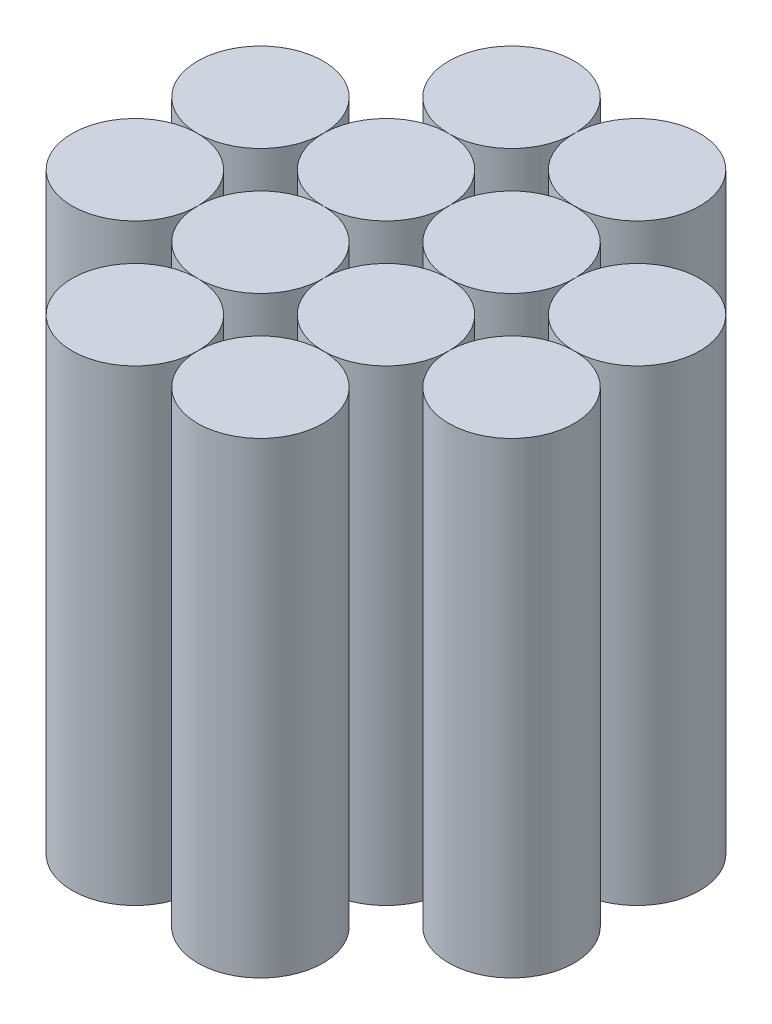
ISO-10303-21;
HEADER;
FILE_DESCRIPTION(('STEP AP214'),'2;1');
FILE_NAME('part.step','',(''),(''),'','','');
FILE_SCHEMA(('AUTOMOTIVE_DESIGN { 1 0 10303 214 1 1 1 1 }'));
ENDSEC;
DATA;
#1=APPLICATION_CONTEXT('core data for automotive mechanical design processes');
#2=APPLICATION_PROTOCOL_DEFINITION('international standard','automotive_design',2000,#1);
#3=PRODUCT_CONTEXT('',#1,'mechanical');
#4=PRODUCT('Part','Part','',(#3));
#5=PRODUCT_RELATED_PRODUCT_CATEGORY('part','',(#4));
#6=PRODUCT_DEFINITION_FORMATION('','',#4);
#7=PRODUCT_DEFINITION_CONTEXT('part definition',#1,'design');
#8=PRODUCT_DEFINITION('design','',#6,#7);
#9=PRODUCT_DEFINITION_SHAPE('','',#8);
#10=(LENGTH_UNIT() NAMED_UNIT(*) SI_UNIT(.MILLI.,.METRE.));
#11=(NAMED_UNIT(*) PLANE_ANGLE_UNIT() SI_UNIT($,.RADIAN.));
#12=(NAMED_UNIT(*) SI_UNIT($,.STERADIAN.) SOLID_ANGLE_UNIT());
#13=UNCERTAINTY_MEASURE_WITH_UNIT(LENGTH_MEASURE(1.E-05),#10,'distance_accuracy_value','');
#14=(GEOMETRIC_REPRESENTATION_CONTEXT(3) GLOBAL_UNCERTAINTY_ASSIGNED_CONTEXT((#13)) GLOBAL_UNIT_ASSIGNED_CONTEXT((#10,
#11,#12)) REPRESENTATION_CONTEXT('',''));
#15=CARTESIAN_POINT('',(0.,0.,0.));
#16=DIRECTION('',(0.,0.,1.));
#17=DIRECTION('',(1.,0.,0.));
#18=AXIS2_PLACEMENT_3D('',#15,#16,#17);
#19=CARTESIAN_POINT('',(-18.,67.,0.));
#20=DIRECTION('',(0.,-1.,0.));
#21=DIRECTION('',(0.,0.,-1.));
#22=AXIS2_PLACEMENT_3D('',#19,#20,#21);
#23=CYLINDRICAL_SURFACE('',#22,9.);
#24=CARTESIAN_POINT('',(-18.,0.,0.));
#25=DIRECTION('',(0.,1.,0.));
#26=DIRECTION('',(0.,0.,1.));
#27=AXIS2_PLACEMENT_3D('',#24,#25,#26);
#28=CIRCLE('',#27,9.);
#29=CARTESIAN_POINT('',(-18.,0.,9.));
#30=VERTEX_POINT('',#29);
#31=EDGE_CURVE('E12',#30,#30,#28,.T.);
#32=ORIENTED_EDGE('',*,*,#31,.T.);
#33=EDGE_LOOP('',(#32));
#34=FACE_BOUND('',#33,.T.);
#35=CARTESIAN_POINT('',(-18.,67.,0.));
#36=DIRECTION('',(0.,1.,0.));
#37=DIRECTION('',(0.,0.,1.));
#38=AXIS2_PLACEMENT_3D('',#35,#36,#37);
#39=CIRCLE('',#38,9.);
#40=CARTESIAN_POINT('',(-18.,67.,9.));
#41=VERTEX_POINT('',#40);
#42=EDGE_CURVE('E117',#41,#41,#39,.T.);
#43=ORIENTED_EDGE('',*,*,#42,.F.);
#44=EDGE_LOOP('',(#43));
#45=FACE_BOUND('',#44,.T.);
#46=ADVANCED_FACE('F113',(#34,#45),#23,.T.);
#47=CARTESIAN_POINT('',(0.,67.,0.));
#48=DIRECTION('',(0.,1.,0.));
#49=DIRECTION('',(0.,0.,1.));
#50=AXIS2_PLACEMENT_3D('',#47,#48,#49);
#51=PLANE('',#50);
#52=ORIENTED_EDGE('',*,*,#42,.T.);
#53=EDGE_LOOP('',(#52));
#54=FACE_BOUND('',#53,.T.);
#55=ADVANCED_FACE('F115',(#54),#51,.T.);
#56=CARTESIAN_POINT('',(0.,0.,0.));
#57=DIRECTION('',(0.,1.,0.));
#58=DIRECTION('',(0.,0.,1.));
#59=AXIS2_PLACEMENT_3D('',#56,#57,#58);
#60=PLANE('',#59);
#61=ORIENTED_EDGE('',*,*,#31,.F.);
#62=EDGE_LOOP('',(#61));
#63=FACE_BOUND('',#62,.T.);
#64=ADVANCED_FACE('F134',(#63),#60,.F.);
#65=CLOSED_SHELL('',(#46,#55,#64));
#66=MANIFOLD_SOLID_BREP('B2',#65);
#67=CARTESIAN_POINT('',(0.,67.,0.));
#68=DIRECTION('',(0.,-1.,0.));
#69=DIRECTION('',(0.,0.,-1.));
#70=AXIS2_PLACEMENT_3D('',#67,#68,#69);
#71=CYLINDRICAL_SURFACE('',#70,9.);
#72=CARTESIAN_POINT('',(0.,0.,0.));
#73=DIRECTION('',(0.,1.,0.));
#74=DIRECTION('',(0.,0.,1.));
#75=AXIS2_PLACEMENT_3D('',#72,#73,#74);
#76=CIRCLE('',#75,9.);
#77=CARTESIAN_POINT('',(0.,0.,9.));
#78=VERTEX_POINT('',#77);
#79=EDGE_CURVE('E112',#78,#78,#76,.T.);
#80=ORIENTED_EDGE('',*,*,#79,.T.);
#81=EDGE_LOOP('',(#80));
#82=FACE_BOUND('',#81,.T.);
#83=CARTESIAN_POINT('',(0.,67.,0.));
#84=DIRECTION('',(0.,1.,0.));
#85=DIRECTION('',(0.,0.,1.));
#86=AXIS2_PLACEMENT_3D('',#83,#84,#85);
#87=CIRCLE('',#86,9.);
#88=CARTESIAN_POINT('',(0.,67.,9.));
#89=VERTEX_POINT('',#88);
#90=EDGE_CURVE('E167',#89,#89,#87,.T.);
#91=ORIENTED_EDGE('',*,*,#90,.F.);
#92=EDGE_LOOP('',(#91));
#93=FACE_BOUND('',#92,.T.);
#94=ADVANCED_FACE('F163',(#82,#93),#71,.T.);
#95=CARTESIAN_POINT('',(0.,67.,0.));
#96=DIRECTION('',(0.,1.,0.));
#97=DIRECTION('',(0.,0.,1.));
#98=AXIS2_PLACEMENT_3D('',#95,#96,#97);
#99=PLANE('',#98);
#100=ORIENTED_EDGE('',*,*,#90,.T.);
#101=EDGE_LOOP('',(#100));
#102=FACE_BOUND('',#101,.T.);
#103=ADVANCED_FACE('F165',(#102),#99,.T.);
#104=CARTESIAN_POINT('',(0.,0.,0.));
#105=DIRECTION('',(0.,1.,0.));
#106=DIRECTION('',(0.,0.,1.));
#107=AXIS2_PLACEMENT_3D('',#104,#105,#106);
#108=PLANE('',#107);
#109=ORIENTED_EDGE('',*,*,#79,.F.);
#110=EDGE_LOOP('',(#109));
#111=FACE_BOUND('',#110,.T.);
#112=ADVANCED_FACE('F182',(#111),#108,.F.);
#113=CLOSED_SHELL('',(#94,#103,#112));
#114=MANIFOLD_SOLID_BREP('B7',#113);
#115=CARTESIAN_POINT('',(-18.,67.,18.));
#116=DIRECTION('',(0.,-1.,0.));
#117=DIRECTION('',(0.,0.,-1.));
#118=AXIS2_PLACEMENT_3D('',#115,#116,#117);
#119=CYLINDRICAL_SURFACE('',#118,9.);
#120=CARTESIAN_POINT('',(-18.,0.,18.));
#121=DIRECTION('',(0.,1.,0.));
#122=DIRECTION('',(0.,0.,1.));
#123=AXIS2_PLACEMENT_3D('',#120,#121,#122);
#124=CIRCLE('',#123,9.);
#125=CARTESIAN_POINT('',(-18.,0.,27.));
#126=VERTEX_POINT('',#125);
#127=EDGE_CURVE('E162',#126,#126,#124,.T.);
#128=ORIENTED_EDGE('',*,*,#127,.T.);
#129=EDGE_LOOP('',(#128));
#130=FACE_BOUND('',#129,.T.);
#131=CARTESIAN_POINT('',(-18.,67.,18.));
#132=DIRECTION('',(0.,1.,0.));
#133=DIRECTION('',(0.,0.,1.));
#134=AXIS2_PLACEMENT_3D('',#131,#132,#133);
#135=CIRCLE('',#134,9.);
#136=CARTESIAN_POINT('',(-18.,67.,27.));
#137=VERTEX_POINT('',#136);
#138=EDGE_CURVE('E215',#137,#137,#135,.T.);
#139=ORIENTED_EDGE('',*,*,#138,.F.);
#140=EDGE_LOOP('',(#139));
#141=FACE_BOUND('',#140,.T.);
#142=ADVANCED_FACE('F211',(#130,#141),#119,.T.);
#143=CARTESIAN_POINT('',(-18.,67.,18.));
#144=DIRECTION('',(0.,1.,0.));
#145=DIRECTION('',(0.,0.,1.));
#146=AXIS2_PLACEMENT_3D('',#143,#144,#145);
#147=PLANE('',#146);
#148=ORIENTED_EDGE('',*,*,#138,.T.);
#149=EDGE_LOOP('',(#148));
#150=FACE_BOUND('',#149,.T.);
#151=ADVANCED_FACE('F213',(#150),#147,.T.);
#152=CARTESIAN_POINT('',(-18.,0.,18.));
#153=DIRECTION('',(0.,1.,0.));
#154=DIRECTION('',(0.,0.,1.));
#155=AXIS2_PLACEMENT_3D('',#152,#153,#154);
#156=PLANE('',#155);
#157=ORIENTED_EDGE('',*,*,#127,.F.);
#158=EDGE_LOOP('',(#157));
#159=FACE_BOUND('',#158,.T.);
#160=ADVANCED_FACE('F230',(#159),#156,.F.);
#161=CLOSED_SHELL('',(#142,#151,#160));
#162=MANIFOLD_SOLID_BREP('B107',#161);
#163=CARTESIAN_POINT('',(0.,67.,-18.));
#164=DIRECTION('',(0.,-1.,0.));
#165=DIRECTION('',(0.,0.,-1.));
#166=AXIS2_PLACEMENT_3D('',#163,#164,#165);
#167=CYLINDRICAL_SURFACE('',#166,9.);
#168=CARTESIAN_POINT('',(0.,0.,-18.));
#169=DIRECTION('',(0.,1.,0.));
#170=DIRECTION('',(0.,0.,1.));
#171=AXIS2_PLACEMENT_3D('',#168,#169,#170);
#172=CIRCLE('',#171,9.);
#173=CARTESIAN_POINT('',(0.,0.,-9.));
#174=VERTEX_POINT('',#173);
#175=EDGE_CURVE('E210',#174,#174,#172,.T.);
#176=ORIENTED_EDGE('',*,*,#175,.T.);
#177=EDGE_LOOP('',(#176));
#178=FACE_BOUND('',#177,.T.);
#179=CARTESIAN_POINT('',(0.,67.,-18.));
#180=DIRECTION('',(0.,1.,0.));
#181=DIRECTION('',(0.,0.,1.));
#182=AXIS2_PLACEMENT_3D('',#179,#180,#181);
#183=CIRCLE('',#182,9.);
#184=CARTESIAN_POINT('',(0.,67.,-9.));
#185=VERTEX_POINT('',#184);
#186=EDGE_CURVE('E263',#185,#185,#183,.T.);
#187=ORIENTED_EDGE('',*,*,#186,.F.);
#188=EDGE_LOOP('',(#187));
#189=FACE_BOUND('',#188,.T.);
#190=ADVANCED_FACE('F259',(#178,#189),#167,.T.);
#191=CARTESIAN_POINT('',(0.,67.,-18.));
#192=DIRECTION('',(0.,1.,0.));
#193=DIRECTION('',(0.,0.,1.));
#194=AXIS2_PLACEMENT_3D('',#191,#192,#193);
#195=PLANE('',#194);
#196=ORIENTED_EDGE('',*,*,#186,.T.);
#197=EDGE_LOOP('',(#196));
#198=FACE_BOUND('',#197,.T.);
#199=ADVANCED_FACE('F261',(#198),#195,.T.);
#200=CARTESIAN_POINT('',(0.,0.,-18.));
#201=DIRECTION('',(0.,1.,0.));
#202=DIRECTION('',(0.,0.,1.));
#203=AXIS2_PLACEMENT_3D('',#200,#201,#202);
#204=PLANE('',#203);
#205=ORIENTED_EDGE('',*,*,#175,.F.);
#206=EDGE_LOOP('',(#205));
#207=FACE_BOUND('',#206,.T.);
#208=ADVANCED_FACE('F278',(#207),#204,.F.);
#209=CLOSED_SHELL('',(#190,#199,#208));
#210=MANIFOLD_SOLID_BREP('B157',#209);
#211=CARTESIAN_POINT('',(0.,67.,18.));
#212=DIRECTION('',(0.,-1.,0.));
#213=DIRECTION('',(0.,0.,-1.));
#214=AXIS2_PLACEMENT_3D('',#211,#212,#213);
#215=CYLINDRICAL_SURFACE('',#214,9.);
#216=CARTESIAN_POINT('',(0.,0.,18.));
#217=DIRECTION('',(0.,1.,0.));
#218=DIRECTION('',(0.,0.,1.));
#219=AXIS2_PLACEMENT_3D('',#216,#217,#218);
#220=CIRCLE('',#219,9.);
#221=CARTESIAN_POINT('',(0.,0.,27.));
#222=VERTEX_POINT('',#221);
#223=EDGE_CURVE('E258',#222,#222,#220,.T.);
#224=ORIENTED_EDGE('',*,*,#223,.T.);
#225=EDGE_LOOP('',(#224));
#226=FACE_BOUND('',#225,.T.);
#227=CARTESIAN_POINT('',(0.,67.,18.));
#228=DIRECTION('',(0.,1.,0.));
#229=DIRECTION('',(0.,0.,1.));
#230=AXIS2_PLACEMENT_3D('',#227,#228,#229);
#231=CIRCLE('',#230,9.);
#232=CARTESIAN_POINT('',(0.,67.,27.));
#233=VERTEX_POINT('',#232);
#234=EDGE_CURVE('E311',#233,#233,#231,.T.);
#235=ORIENTED_EDGE('',*,*,#234,.F.);
#236=EDGE_LOOP('',(#235));
#237=FACE_BOUND('',#236,.T.);
#238=ADVANCED_FACE('F307',(#226,#237),#215,.T.);
#239=CARTESIAN_POINT('',(0.,67.,18.));
#240=DIRECTION('',(0.,1.,0.));
#241=DIRECTION('',(0.,0.,1.));
#242=AXIS2_PLACEMENT_3D('',#239,#240,#241);
#243=PLANE('',#242);
#244=ORIENTED_EDGE('',*,*,#234,.T.);
#245=EDGE_LOOP('',(#244));
#246=FACE_BOUND('',#245,.T.);
#247=ADVANCED_FACE('F309',(#246),#243,.T.);
#248=CARTESIAN_POINT('',(0.,0.,18.));
#249=DIRECTION('',(0.,1.,0.));
#250=DIRECTION('',(0.,0.,1.));
#251=AXIS2_PLACEMENT_3D('',#248,#249,#250);
#252=PLANE('',#251);
#253=ORIENTED_EDGE('',*,*,#223,.F.);
#254=EDGE_LOOP('',(#253));
#255=FACE_BOUND('',#254,.T.);
#256=ADVANCED_FACE('F326',(#255),#252,.F.);
#257=CLOSED_SHELL('',(#238,#247,#256));
#258=MANIFOLD_SOLID_BREP('B205',#257);
#259=CARTESIAN_POINT('',(18.,67.,0.));
#260=DIRECTION('',(0.,-1.,0.));
#261=DIRECTION('',(0.,0.,-1.));
#262=AXIS2_PLACEMENT_3D('',#259,#260,#261);
#263=CYLINDRICAL_SURFACE('',#262,9.);
#264=CARTESIAN_POINT('',(18.,0.,0.));
#265=DIRECTION('',(0.,1.,0.));
#266=DIRECTION('',(0.,0.,1.));
#267=AXIS2_PLACEMENT_3D('',#264,#265,#266);
#268=CIRCLE('',#267,9.);
#269=CARTESIAN_POINT('',(18.,0.,9.));
#270=VERTEX_POINT('',#269);
#271=EDGE_CURVE('E306',#270,#270,#268,.T.);
#272=ORIENTED_EDGE('',*,*,#271,.T.);
#273=EDGE_LOOP('',(#272));
#274=FACE_BOUND('',#273,.T.);
#275=CARTESIAN_POINT('',(18.,67.,0.));
#276=DIRECTION('',(0.,1.,0.));
#277=DIRECTION('',(0.,0.,1.));
#278=AXIS2_PLACEMENT_3D('',#275,#276,#277);
#279=CIRCLE('',#278,9.);
#280=CARTESIAN_POINT('',(18.,67.,9.));
#281=VERTEX_POINT('',#280);
#282=EDGE_CURVE('E359',#281,#281,#279,.T.);
#283=ORIENTED_EDGE('',*,*,#282,.F.);
#284=EDGE_LOOP('',(#283));
#285=FACE_BOUND('',#284,.T.);
#286=ADVANCED_FACE('F355',(#274,#285),#263,.T.);
#287=CARTESIAN_POINT('',(18.,67.,0.));
#288=DIRECTION('',(0.,1.,0.));
#289=DIRECTION('',(0.,0.,1.));
#290=AXIS2_PLACEMENT_3D('',#287,#288,#289);
#291=PLANE('',#290);
#292=ORIENTED_EDGE('',*,*,#282,.T.);
#293=EDGE_LOOP('',(#292));
#294=FACE_BOUND('',#293,.T.);
#295=ADVANCED_FACE('F357',(#294),#291,.T.);
#296=CARTESIAN_POINT('',(18.,0.,0.));
#297=DIRECTION('',(0.,1.,0.));
#298=DIRECTION('',(0.,0.,1.));
#299=AXIS2_PLACEMENT_3D('',#296,#297,#298);
#300=PLANE('',#299);
#301=ORIENTED_EDGE('',*,*,#271,.F.);
#302=EDGE_LOOP('',(#301));
#303=FACE_BOUND('',#302,.T.);
#304=ADVANCED_FACE('F374',(#303),#300,.F.);
#305=CLOSED_SHELL('',(#286,#295,#304));
#306=MANIFOLD_SOLID_BREP('B253',#305);
#307=CARTESIAN_POINT('',(18.,67.,-18.));
#308=DIRECTION('',(0.,-1.,0.));
#309=DIRECTION('',(0.,0.,-1.));
#310=AXIS2_PLACEMENT_3D('',#307,#308,#309);
#311=CYLINDRICAL_SURFACE('',#310,9.);
#312=CARTESIAN_POINT('',(18.,0.,-18.));
#313=DIRECTION('',(0.,1.,0.));
#314=DIRECTION('',(0.,0.,1.));
#315=AXIS2_PLACEMENT_3D('',#312,#313,#314);
#316=CIRCLE('',#315,9.);
#317=CARTESIAN_POINT('',(18.,0.,-9.));
#318=VERTEX_POINT('',#317);
#319=EDGE_CURVE('E354',#318,#318,#316,.T.);
#320=ORIENTED_EDGE('',*,*,#319,.T.);
#321=EDGE_LOOP('',(#320));
#322=FACE_BOUND('',#321,.T.);
#323=CARTESIAN_POINT('',(18.,67.,-18.));
#324=DIRECTION('',(0.,1.,0.));
#325=DIRECTION('',(0.,0.,1.));
#326=AXIS2_PLACEMENT_3D('',#323,#324,#325);
#327=CIRCLE('',#326,9.);
#328=CARTESIAN_POINT('',(18.,67.,-9.));
#329=VERTEX_POINT('',#328);
#330=EDGE_CURVE('E407',#329,#329,#327,.T.);
#331=ORIENTED_EDGE('',*,*,#330,.F.);
#332=EDGE_LOOP('',(#331));
#333=FACE_BOUND('',#332,.T.);
#334=ADVANCED_FACE('F403',(#322,#333),#311,.T.);
#335=CARTESIAN_POINT('',(18.,67.,-18.));
#336=DIRECTION('',(0.,1.,0.));
#337=DIRECTION('',(0.,0.,1.));
#338=AXIS2_PLACEMENT_3D('',#335,#336,#337);
#339=PLANE('',#338);
#340=ORIENTED_EDGE('',*,*,#330,.T.);
#341=EDGE_LOOP('',(#340));
#342=FACE_BOUND('',#341,.T.);
#343=ADVANCED_FACE('F405',(#342),#339,.T.);
#344=CARTESIAN_POINT('',(18.,0.,-18.));
#345=DIRECTION('',(0.,1.,0.));
#346=DIRECTION('',(0.,0.,1.));
#347=AXIS2_PLACEMENT_3D('',#344,#345,#346);
#348=PLANE('',#347);
#349=ORIENTED_EDGE('',*,*,#319,.F.);
#350=EDGE_LOOP('',(#349));
#351=FACE_BOUND('',#350,.T.);
#352=ADVANCED_FACE('F422',(#351),#348,.F.);
#353=CLOSED_SHELL('',(#334,#343,#352));
#354=MANIFOLD_SOLID_BREP('B301',#353);
#355=CARTESIAN_POINT('',(36.,67.,0.));
#356=DIRECTION('',(0.,-1.,0.));
#357=DIRECTION('',(0.,0.,-1.));
#358=AXIS2_PLACEMENT_3D('',#355,#356,#357);
#359=CYLINDRICAL_SURFACE('',#358,9.);
#360=CARTESIAN_POINT('',(36.,0.,0.));
#361=DIRECTION('',(0.,1.,0.));
#362=DIRECTION('',(0.,0.,1.));
#363=AXIS2_PLACEMENT_3D('',#360,#361,#362);
#364=CIRCLE('',#363,9.);
#365=CARTESIAN_POINT('',(36.,0.,9.));
#366=VERTEX_POINT('',#365);
#367=EDGE_CURVE('E402',#366,#366,#364,.T.);
#368=ORIENTED_EDGE('',*,*,#367,.T.);
#369=EDGE_LOOP('',(#368));
#370=FACE_BOUND('',#369,.T.);
#371=CARTESIAN_POINT('',(36.,67.,0.));
#372=DIRECTION('',(0.,1.,0.));
#373=DIRECTION('',(0.,0.,1.));
#374=AXIS2_PLACEMENT_3D('',#371,#372,#373);
#375=CIRCLE('',#374,9.);
#376=CARTESIAN_POINT('',(36.,67.,9.));
#377=VERTEX_POINT('',#376);
#378=EDGE_CURVE('E455',#377,#377,#375,.T.);
#379=ORIENTED_EDGE('',*,*,#378,.F.);
#380=EDGE_LOOP('',(#379));
#381=FACE_BOUND('',#380,.T.);
#382=ADVANCED_FACE('F451',(#370,#381),#359,.T.);
#383=CARTESIAN_POINT('',(36.,67.,0.));
#384=DIRECTION('',(0.,1.,0.));
#385=DIRECTION('',(0.,0.,1.));
#386=AXIS2_PLACEMENT_3D('',#383,#384,#385);
#387=PLANE('',#386);
#388=ORIENTED_EDGE('',*,*,#378,.T.);
#389=EDGE_LOOP('',(#388));
#390=FACE_BOUND('',#389,.T.);
#391=ADVANCED_FACE('F453',(#390),#387,.T.);
#392=CARTESIAN_POINT('',(36.,0.,0.));
#393=DIRECTION('',(0.,1.,0.));
#394=DIRECTION('',(0.,0.,1.));
#395=AXIS2_PLACEMENT_3D('',#392,#393,#394);
#396=PLANE('',#395);
#397=ORIENTED_EDGE('',*,*,#367,.F.);
#398=EDGE_LOOP('',(#397));
#399=FACE_BOUND('',#398,.T.);
#400=ADVANCED_FACE('F470',(#399),#396,.F.);
#401=CLOSED_SHELL('',(#382,#391,#400));
#402=MANIFOLD_SOLID_BREP('B349',#401);
#403=CARTESIAN_POINT('',(18.,67.,18.));
#404=DIRECTION('',(0.,-1.,0.));
#405=DIRECTION('',(0.,0.,-1.));
#406=AXIS2_PLACEMENT_3D('',#403,#404,#405);
#407=CYLINDRICAL_SURFACE('',#406,9.);
#408=CARTESIAN_POINT('',(18.,0.,18.));
#409=DIRECTION('',(0.,1.,0.));
#410=DIRECTION('',(0.,0.,1.));
#411=AXIS2_PLACEMENT_3D('',#408,#409,#410);
#412=CIRCLE('',#411,9.);
#413=CARTESIAN_POINT('',(18.,0.,27.));
#414=VERTEX_POINT('',#413);
#415=EDGE_CURVE('E450',#414,#414,#412,.T.);
#416=ORIENTED_EDGE('',*,*,#415,.T.);
#417=EDGE_LOOP('',(#416));
#418=FACE_BOUND('',#417,.T.);
#419=CARTESIAN_POINT('',(18.,67.,18.));
#420=DIRECTION('',(0.,1.,0.));
#421=DIRECTION('',(0.,0.,1.));
#422=AXIS2_PLACEMENT_3D('',#419,#420,#421);
#423=CIRCLE('',#422,9.);
#424=CARTESIAN_POINT('',(18.,67.,27.));
#425=VERTEX_POINT('',#424);
#426=EDGE_CURVE('E503',#425,#425,#423,.T.);
#427=ORIENTED_EDGE('',*,*,#426,.F.);
#428=EDGE_LOOP('',(#427));
#429=FACE_BOUND('',#428,.T.);
#430=ADVANCED_FACE('F499',(#418,#429),#407,.T.);
#431=CARTESIAN_POINT('',(18.,67.,18.));
#432=DIRECTION('',(0.,1.,0.));
#433=DIRECTION('',(0.,0.,1.));
#434=AXIS2_PLACEMENT_3D('',#431,#432,#433);
#435=PLANE('',#434);
#436=ORIENTED_EDGE('',*,*,#426,.T.);
#437=EDGE_LOOP('',(#436));
#438=FACE_BOUND('',#437,.T.);
#439=ADVANCED_FACE('F501',(#438),#435,.T.);
#440=CARTESIAN_POINT('',(18.,0.,18.));
#441=DIRECTION('',(0.,1.,0.));
#442=DIRECTION('',(0.,0.,1.));
#443=AXIS2_PLACEMENT_3D('',#440,#441,#442);
#444=PLANE('',#443);
#445=ORIENTED_EDGE('',*,*,#415,.F.);
#446=EDGE_LOOP('',(#445));
#447=FACE_BOUND('',#446,.T.);
#448=ADVANCED_FACE('F518',(#447),#444,.F.);
#449=CLOSED_SHELL('',(#430,#439,#448));
#450=MANIFOLD_SOLID_BREP('B397',#449);
#451=CARTESIAN_POINT('',(36.,67.,18.));
#452=DIRECTION('',(0.,-1.,0.));
#453=DIRECTION('',(0.,0.,-1.));
#454=AXIS2_PLACEMENT_3D('',#451,#452,#453);
#455=CYLINDRICAL_SURFACE('',#454,9.);
#456=CARTESIAN_POINT('',(36.,0.,18.));
#457=DIRECTION('',(0.,1.,0.));
#458=DIRECTION('',(0.,0.,1.));
#459=AXIS2_PLACEMENT_3D('',#456,#457,#458);
#460=CIRCLE('',#459,9.);
#461=CARTESIAN_POINT('',(36.,0.,27.));
#462=VERTEX_POINT('',#461);
#463=EDGE_CURVE('E498',#462,#462,#460,.T.);
#464=ORIENTED_EDGE('',*,*,#463,.T.);
#465=EDGE_LOOP('',(#464));
#466=FACE_BOUND('',#465,.T.);
#467=CARTESIAN_POINT('',(36.,67.,18.));
#468=DIRECTION('',(0.,1.,0.));
#469=DIRECTION('',(0.,0.,1.));
#470=AXIS2_PLACEMENT_3D('',#467,#468,#469);
#471=CIRCLE('',#470,9.);
#472=CARTESIAN_POINT('',(36.,67.,27.));
#473=VERTEX_POINT('',#472);
#474=EDGE_CURVE('E551',#473,#473,#471,.T.);
#475=ORIENTED_EDGE('',*,*,#474,.F.);
#476=EDGE_LOOP('',(#475));
#477=FACE_BOUND('',#476,.T.);
#478=ADVANCED_FACE('F547',(#466,#477),#455,.T.);
#479=CARTESIAN_POINT('',(36.,67.,18.));
#480=DIRECTION('',(0.,1.,0.));
#481=DIRECTION('',(0.,0.,1.));
#482=AXIS2_PLACEMENT_3D('',#479,#480,#481);
#483=PLANE('',#482);
#484=ORIENTED_EDGE('',*,*,#474,.T.);
#485=EDGE_LOOP('',(#484));
#486=FACE_BOUND('',#485,.T.);
#487=ADVANCED_FACE('F549',(#486),#483,.T.);
#488=CARTESIAN_POINT('',(36.,0.,18.));
#489=DIRECTION('',(0.,1.,0.));
#490=DIRECTION('',(0.,0.,1.));
#491=AXIS2_PLACEMENT_3D('',#488,#489,#490);
#492=PLANE('',#491);
#493=ORIENTED_EDGE('',*,*,#463,.F.);
#494=EDGE_LOOP('',(#493));
#495=FACE_BOUND('',#494,.T.);
#496=ADVANCED_FACE('F566',(#495),#492,.F.);
#497=CLOSED_SHELL('',(#478,#487,#496));
#498=MANIFOLD_SOLID_BREP('B445',#497);
#499=CARTESIAN_POINT('',(18.,67.,36.));
#500=DIRECTION('',(0.,-1.,0.));
#501=DIRECTION('',(0.,0.,-1.));
#502=AXIS2_PLACEMENT_3D('',#499,#500,#501);
#503=CYLINDRICAL_SURFACE('',#502,9.);
#504=CARTESIAN_POINT('',(18.,0.,36.));
#505=DIRECTION('',(0.,1.,0.));
#506=DIRECTION('',(0.,0.,1.));
#507=AXIS2_PLACEMENT_3D('',#504,#505,#506);
#508=CIRCLE('',#507,9.);
#509=CARTESIAN_POINT('',(18.,0.,45.));
#510=VERTEX_POINT('',#509);
#511=EDGE_CURVE('E546',#510,#510,#508,.T.);
#512=ORIENTED_EDGE('',*,*,#511,.T.);
#513=EDGE_LOOP('',(#512));
#514=FACE_BOUND('',#513,.T.);
#515=CARTESIAN_POINT('',(18.,67.,36.));
#516=DIRECTION('',(0.,1.,0.));
#517=DIRECTION('',(0.,0.,1.));
#518=AXIS2_PLACEMENT_3D('',#515,#516,#517);
#519=CIRCLE('',#518,9.);
#520=CARTESIAN_POINT('',(18.,67.,45.));
#521=VERTEX_POINT('',#520);
#522=EDGE_CURVE('E598',#521,#521,#519,.T.);
#523=ORIENTED_EDGE('',*,*,#522,.F.);
#524=EDGE_LOOP('',(#523));
#525=FACE_BOUND('',#524,.T.);
#526=ADVANCED_FACE('F594',(#514,#525),#503,.T.);
#527=CARTESIAN_POINT('',(18.,67.,36.));
#528=DIRECTION('',(0.,1.,0.));
#529=DIRECTION('',(0.,0.,1.));
#530=AXIS2_PLACEMENT_3D('',#527,#528,#529);
#531=PLANE('',#530);
#532=ORIENTED_EDGE('',*,*,#522,.T.);
#533=EDGE_LOOP('',(#532));
#534=FACE_BOUND('',#533,.T.);
#535=ADVANCED_FACE('F596',(#534),#531,.T.);
#536=CARTESIAN_POINT('',(18.,0.,36.));
#537=DIRECTION('',(0.,1.,0.));
#538=DIRECTION('',(0.,0.,1.));
#539=AXIS2_PLACEMENT_3D('',#536,#537,#538);
#540=PLANE('',#539);
#541=ORIENTED_EDGE('',*,*,#511,.F.);
#542=EDGE_LOOP('',(#541));
#543=FACE_BOUND('',#542,.T.);
#544=ADVANCED_FACE('F613',(#543),#540,.F.);
#545=CLOSED_SHELL('',(#526,#535,#544));
#546=MANIFOLD_SOLID_BREP('B493',#545);
#547=CARTESIAN_POINT('',(0.,67.,36.));
#548=DIRECTION('',(0.,-1.,0.));
#549=DIRECTION('',(0.,0.,-1.));
#550=AXIS2_PLACEMENT_3D('',#547,#548,#549);
#551=CYLINDRICAL_SURFACE('',#550,9.);
#552=CARTESIAN_POINT('',(0.,0.,36.));
#553=DIRECTION('',(0.,1.,0.));
#554=DIRECTION('',(0.,0.,1.));
#555=AXIS2_PLACEMENT_3D('',#552,#553,#554);
#556=CIRCLE('',#555,9.);
#557=CARTESIAN_POINT('',(0.,0.,45.));
#558=VERTEX_POINT('',#557);
#559=EDGE_CURVE('E637',#558,#558,#556,.T.);
#560=ORIENTED_EDGE('',*,*,#559,.T.);
#561=EDGE_LOOP('',(#560));
#562=FACE_BOUND('',#561,.T.);
#563=CARTESIAN_POINT('',(0.,67.,36.));
#564=DIRECTION('',(0.,1.,0.));
#565=DIRECTION('',(0.,0.,1.));
#566=AXIS2_PLACEMENT_3D('',#563,#564,#565);
#567=CIRCLE('',#566,9.);
#568=CARTESIAN_POINT('',(0.,67.,45.));
#569=VERTEX_POINT('',#568);
#570=EDGE_CURVE('E593',#569,#569,#567,.T.);
#571=ORIENTED_EDGE('',*,*,#570,.F.);
#572=EDGE_LOOP('',(#571));
#573=FACE_BOUND('',#572,.T.);
#574=ADVANCED_FACE('F634',(#562,#573),#551,.T.);
#575=CARTESIAN_POINT('',(0.,67.,36.));
#576=DIRECTION('',(0.,1.,0.));
#577=DIRECTION('',(0.,0.,1.));
#578=AXIS2_PLACEMENT_3D('',#575,#576,#577);
#579=PLANE('',#578);
#580=ORIENTED_EDGE('',*,*,#570,.T.);
#581=EDGE_LOOP('',(#580));
#582=FACE_BOUND('',#581,.T.);
#583=ADVANCED_FACE('F650',(#582),#579,.T.);
#584=CARTESIAN_POINT('',(0.,0.,36.));
#585=DIRECTION('',(0.,1.,0.));
#586=DIRECTION('',(0.,0.,1.));
#587=AXIS2_PLACEMENT_3D('',#584,#585,#586);
#588=PLANE('',#587);
#589=ORIENTED_EDGE('',*,*,#559,.F.);
#590=EDGE_LOOP('',(#589));
#591=FACE_BOUND('',#590,.T.);
#592=ADVANCED_FACE('F648',(#591),#588,.F.);
#593=CLOSED_SHELL('',(#574,#583,#592));
#594=MANIFOLD_SOLID_BREP('B541',#593);
#595=ADVANCED_BREP_SHAPE_REPRESENTATION('',(#18,#66,#114,#162,#210,#258,#306,#354,#402,#450,
#498,#546,#594),#14);
#596=SHAPE_DEFINITION_REPRESENTATION(#9,#595);
ENDSEC;
END-ISO-10303-21;
